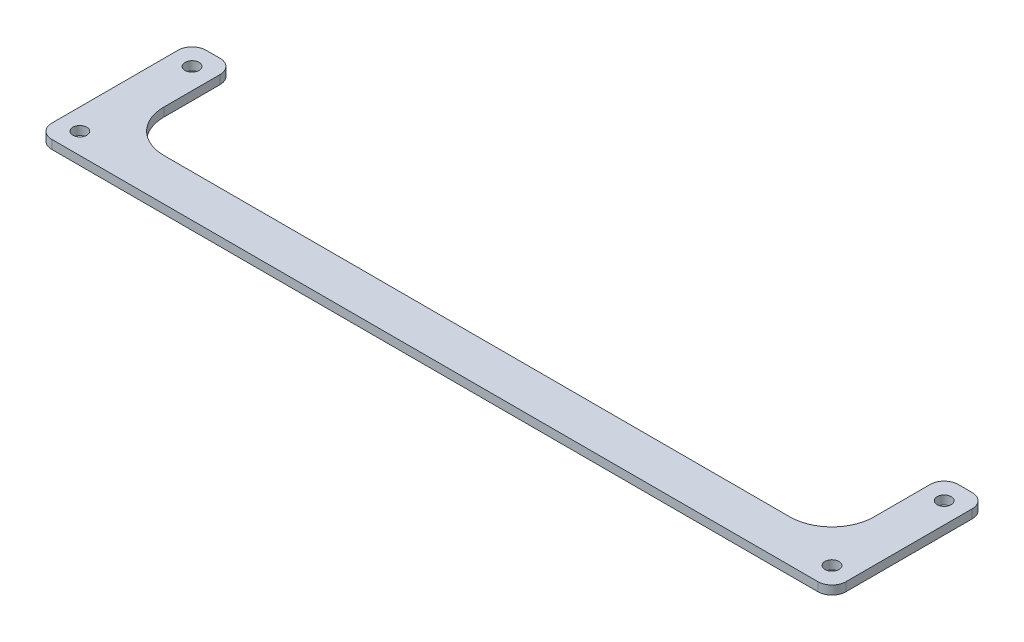
ISO-10303-21;
HEADER;
FILE_DESCRIPTION(('STEP AP214'),'2;1');
FILE_NAME('part.step','',(''),(''),'','','');
FILE_SCHEMA(('AUTOMOTIVE_DESIGN { 1 0 10303 214 1 1 1 1 }'));
ENDSEC;
DATA;
#1=APPLICATION_CONTEXT('core data for automotive mechanical design processes');
#2=APPLICATION_PROTOCOL_DEFINITION('international standard','automotive_design',2000,#1);
#3=PRODUCT_CONTEXT('',#1,'mechanical');
#4=PRODUCT('Part','Part','',(#3));
#5=PRODUCT_RELATED_PRODUCT_CATEGORY('part','',(#4));
#6=PRODUCT_DEFINITION_FORMATION('','',#4);
#7=PRODUCT_DEFINITION_CONTEXT('part definition',#1,'design');
#8=PRODUCT_DEFINITION('design','',#6,#7);
#9=PRODUCT_DEFINITION_SHAPE('','',#8);
#10=(LENGTH_UNIT() NAMED_UNIT(*) SI_UNIT(.MILLI.,.METRE.));
#11=(NAMED_UNIT(*) PLANE_ANGLE_UNIT() SI_UNIT($,.RADIAN.));
#12=(NAMED_UNIT(*) SI_UNIT($,.STERADIAN.) SOLID_ANGLE_UNIT());
#13=UNCERTAINTY_MEASURE_WITH_UNIT(LENGTH_MEASURE(1.E-05),#10,'distance_accuracy_value','');
#14=(GEOMETRIC_REPRESENTATION_CONTEXT(3) GLOBAL_UNCERTAINTY_ASSIGNED_CONTEXT((#13)) GLOBAL_UNIT_ASSIGNED_CONTEXT((#10,
#11,#12)) REPRESENTATION_CONTEXT('',''));
#15=CARTESIAN_POINT('',(0.,0.,0.));
#16=DIRECTION('',(0.,0.,1.));
#17=DIRECTION('',(1.,0.,0.));
#18=AXIS2_PLACEMENT_3D('',#15,#16,#17);
#19=CARTESIAN_POINT('',(0.,2.5,0.));
#20=DIRECTION('',(0.,1.,0.));
#21=DIRECTION('',(0.,0.,1.));
#22=AXIS2_PLACEMENT_3D('',#19,#20,#21);
#23=PLANE('',#22);
#24=CARTESIAN_POINT('',(193.665714924376,2.5,29.1309433813816));
#25=DIRECTION('',(0.,1.,0.));
#26=DIRECTION('',(0.,0.,1.));
#27=AXIS2_PLACEMENT_3D('',#24,#25,#26);
#28=CIRCLE('',#27,2.);
#29=CARTESIAN_POINT('',(193.665714924376,2.5,31.1309433813816));
#30=VERTEX_POINT('',#29);
#31=EDGE_CURVE('E583',#30,#30,#28,.T.);
#32=ORIENTED_EDGE('',*,*,#31,.F.);
#33=EDGE_LOOP('',(#32));
#34=FACE_BOUND('',#33,.T.);
#35=CARTESIAN_POINT('',(-20.7988364756241,2.5,-2.86905661861837));
#36=DIRECTION('',(0.,1.,0.));
#37=DIRECTION('',(0.,0.,1.));
#38=AXIS2_PLACEMENT_3D('',#35,#36,#37);
#39=CIRCLE('',#38,2.);
#40=CARTESIAN_POINT('',(-20.7988364756241,2.5,-0.869056618618374));
#41=VERTEX_POINT('',#40);
#42=EDGE_CURVE('E327',#41,#41,#39,.T.);
#43=ORIENTED_EDGE('',*,*,#42,.F.);
#44=EDGE_LOOP('',(#43));
#45=FACE_BOUND('',#44,.T.);
#46=DIRECTION('',(0.,0.,-1.));
#47=VECTOR('',#46,1.);
#48=CARTESIAN_POINT('',(199.665714924376,2.5,35.1309433813817));
#49=LINE('',#48,#47);
#50=CARTESIAN_POINT('',(199.665714924376,2.5,31.1309433813817));
#51=VERTEX_POINT('',#50);
#52=CARTESIAN_POINT('',(199.665714924376,2.5,-4.86905661861846));
#53=VERTEX_POINT('',#52);
#54=EDGE_CURVE('E306',#51,#53,#49,.T.);
#55=ORIENTED_EDGE('',*,*,#54,.T.);
#56=CARTESIAN_POINT('',(195.665714924376,2.5,-4.86905661861846));
#57=DIRECTION('',(0.,1.,0.));
#58=DIRECTION('',(0.,0.,1.));
#59=AXIS2_PLACEMENT_3D('',#56,#57,#58);
#60=CIRCLE('',#59,4.);
#61=CARTESIAN_POINT('',(195.665714924376,2.5,-8.86905661861846));
#62=VERTEX_POINT('',#61);
#63=EDGE_CURVE('E240',#53,#62,#60,.T.);
#64=ORIENTED_EDGE('',*,*,#63,.T.);
#65=DIRECTION('',(-1.,0.,0.));
#66=VECTOR('',#65,1.);
#67=CARTESIAN_POINT('',(199.665714924376,2.5,-8.86905661861846));
#68=LINE('',#67,#66);
#69=CARTESIAN_POINT('',(191.665714924376,2.5,-8.86905661861846));
#70=VERTEX_POINT('',#69);
#71=EDGE_CURVE('E173',#62,#70,#68,.T.);
#72=ORIENTED_EDGE('',*,*,#71,.T.);
#73=CARTESIAN_POINT('',(191.665714924376,2.5,-4.86905661861846));
#74=DIRECTION('',(0.,1.,0.));
#75=DIRECTION('',(0.,0.,1.));
#76=AXIS2_PLACEMENT_3D('',#73,#74,#75);
#77=CIRCLE('',#76,4.);
#78=CARTESIAN_POINT('',(187.665714924376,2.5,-4.86905661861846));
#79=VERTEX_POINT('',#78);
#80=EDGE_CURVE('E237',#70,#79,#77,.T.);
#81=ORIENTED_EDGE('',*,*,#80,.T.);
#82=DIRECTION('',(0.,0.,1.));
#83=VECTOR('',#82,1.);
#84=CARTESIAN_POINT('',(187.665714924376,2.5,-8.86905661861846));
#85=LINE('',#84,#83);
#86=CARTESIAN_POINT('',(187.665714924376,2.5,11.1309433813815));
#87=VERTEX_POINT('',#86);
#88=EDGE_CURVE('E301',#79,#87,#85,.T.);
#89=ORIENTED_EDGE('',*,*,#88,.T.);
#90=CARTESIAN_POINT('',(175.665714924376,2.5,11.1309433813815));
#91=DIRECTION('',(0.,1.,0.));
#92=DIRECTION('',(0.,0.,1.));
#93=AXIS2_PLACEMENT_3D('',#90,#91,#92);
#94=CIRCLE('',#93,12.);
#95=CARTESIAN_POINT('',(175.665714924376,2.5,23.1309433813815));
#96=VERTEX_POINT('',#95);
#97=EDGE_CURVE('E11',#87,#96,#94,.F.);
#98=ORIENTED_EDGE('',*,*,#97,.T.);
#99=DIRECTION('',(-1.,0.,0.));
#100=VECTOR('',#99,1.);
#101=CARTESIAN_POINT('',(-14.7988364756241,2.5,23.1309433813816));
#102=LINE('',#101,#100);
#103=CARTESIAN_POINT('',(-2.7988364756241,2.5,23.1309433813816));
#104=VERTEX_POINT('',#103);
#105=EDGE_CURVE('E297',#96,#104,#102,.T.);
#106=ORIENTED_EDGE('',*,*,#105,.T.);
#107=CARTESIAN_POINT('',(-2.7988364756241,2.5,11.1309433813816));
#108=DIRECTION('',(0.,1.,0.));
#109=DIRECTION('',(0.,0.,1.));
#110=AXIS2_PLACEMENT_3D('',#107,#108,#109);
#111=CIRCLE('',#110,12.);
#112=CARTESIAN_POINT('',(-14.7988364756241,2.5,11.1309433813816));
#113=VERTEX_POINT('',#112);
#114=EDGE_CURVE('E288',#104,#113,#111,.F.);
#115=ORIENTED_EDGE('',*,*,#114,.T.);
#116=DIRECTION('',(0.,0.,-1.));
#117=VECTOR('',#116,1.);
#118=CARTESIAN_POINT('',(-14.7988364756241,2.5,-8.86905661861843));
#119=LINE('',#118,#117);
#120=CARTESIAN_POINT('',(-14.7988364756241,2.5,-4.86905661861844));
#121=VERTEX_POINT('',#120);
#122=EDGE_CURVE('E294',#113,#121,#119,.T.);
#123=ORIENTED_EDGE('',*,*,#122,.T.);
#124=CARTESIAN_POINT('',(-18.7988364756241,2.5,-4.86905661861844));
#125=DIRECTION('',(0.,1.,0.));
#126=DIRECTION('',(0.,0.,1.));
#127=AXIS2_PLACEMENT_3D('',#124,#125,#126);
#128=CIRCLE('',#127,4.);
#129=CARTESIAN_POINT('',(-18.7988364756241,2.5,-8.86905661861844));
#130=VERTEX_POINT('',#129);
#131=EDGE_CURVE('E234',#121,#130,#128,.T.);
#132=ORIENTED_EDGE('',*,*,#131,.T.);
#133=DIRECTION('',(-1.,0.,0.));
#134=VECTOR('',#133,1.);
#135=CARTESIAN_POINT('',(-14.7988364756241,2.5,-8.86905661861843));
#136=LINE('',#135,#134);
#137=CARTESIAN_POINT('',(-22.7988364756241,2.5,-8.86905661861844));
#138=VERTEX_POINT('',#137);
#139=EDGE_CURVE('E204',#130,#138,#136,.T.);
#140=ORIENTED_EDGE('',*,*,#139,.T.);
#141=CARTESIAN_POINT('',(-22.7988364756241,2.5,-4.86905661861844));
#142=DIRECTION('',(0.,1.,0.));
#143=DIRECTION('',(0.,0.,1.));
#144=AXIS2_PLACEMENT_3D('',#141,#142,#143);
#145=CIRCLE('',#144,4.);
#146=CARTESIAN_POINT('',(-26.7988364756241,2.5,-4.86905661861844));
#147=VERTEX_POINT('',#146);
#148=EDGE_CURVE('E231',#138,#147,#145,.T.);
#149=ORIENTED_EDGE('',*,*,#148,.T.);
#150=DIRECTION('',(0.,0.,1.));
#151=VECTOR('',#150,1.);
#152=CARTESIAN_POINT('',(-26.7988364756241,2.5,35.1309433813818));
#153=LINE('',#152,#151);
#154=CARTESIAN_POINT('',(-26.7988364756241,2.5,31.1309433813818));
#155=VERTEX_POINT('',#154);
#156=EDGE_CURVE('E202',#147,#155,#153,.T.);
#157=ORIENTED_EDGE('',*,*,#156,.T.);
#158=CARTESIAN_POINT('',(-22.7988364756241,2.5,31.1309433813818));
#159=DIRECTION('',(0.,1.,0.));
#160=DIRECTION('',(0.,0.,1.));
#161=AXIS2_PLACEMENT_3D('',#158,#159,#160);
#162=CIRCLE('',#161,4.);
#163=CARTESIAN_POINT('',(-22.7988364756241,2.5,35.1309433813818));
#164=VERTEX_POINT('',#163);
#165=EDGE_CURVE('E225',#155,#164,#162,.T.);
#166=ORIENTED_EDGE('',*,*,#165,.T.);
#167=DIRECTION('',(1.,0.,0.));
#168=VECTOR('',#167,1.);
#169=CARTESIAN_POINT('',(199.665714924376,2.5,35.1309433813817));
#170=LINE('',#169,#168);
#171=CARTESIAN_POINT('',(195.665714924376,2.5,35.1309433813817));
#172=VERTEX_POINT('',#171);
#173=EDGE_CURVE('E310',#164,#172,#170,.T.);
#174=ORIENTED_EDGE('',*,*,#173,.T.);
#175=CARTESIAN_POINT('',(195.665714924376,2.5,31.1309433813817));
#176=DIRECTION('',(0.,1.,0.));
#177=DIRECTION('',(0.,0.,1.));
#178=AXIS2_PLACEMENT_3D('',#175,#176,#177);
#179=CIRCLE('',#178,4.);
#180=EDGE_CURVE('E228',#172,#51,#179,.T.);
#181=ORIENTED_EDGE('',*,*,#180,.T.);
#182=EDGE_LOOP('',(#55,#64,#72,#81,#89,#98,#106,#115,#123,#132,#140,#149,#157,#166,#174,#181));
#183=FACE_BOUND('',#182,.T.);
#184=CARTESIAN_POINT('',(-20.7988364756241,2.5,29.1309433813817));
#185=DIRECTION('',(0.,1.,0.));
#186=DIRECTION('',(0.,0.,1.));
#187=AXIS2_PLACEMENT_3D('',#184,#185,#186);
#188=CIRCLE('',#187,2.);
#189=CARTESIAN_POINT('',(-20.7988364756241,2.5,31.1309433813817));
#190=VERTEX_POINT('',#189);
#191=EDGE_CURVE('E574',#190,#190,#188,.T.);
#192=ORIENTED_EDGE('',*,*,#191,.F.);
#193=EDGE_LOOP('',(#192));
#194=FACE_BOUND('',#193,.T.);
#195=CARTESIAN_POINT('',(193.665714924376,2.5,-2.86905661861827));
#196=DIRECTION('',(0.,1.,0.));
#197=DIRECTION('',(0.,0.,1.));
#198=AXIS2_PLACEMENT_3D('',#195,#196,#197);
#199=CIRCLE('',#198,2.);
#200=CARTESIAN_POINT('',(193.665714924376,2.5,-0.869056618618276));
#201=VERTEX_POINT('',#200);
#202=EDGE_CURVE('E590',#201,#201,#199,.T.);
#203=ORIENTED_EDGE('',*,*,#202,.F.);
#204=EDGE_LOOP('',(#203));
#205=FACE_BOUND('',#204,.T.);
#206=ADVANCED_FACE('F39',(#34,#45,#183,#194,#205),#23,.T.);
#207=CARTESIAN_POINT('',(0.,0.,0.));
#208=DIRECTION('',(0.,1.,0.));
#209=DIRECTION('',(0.,0.,1.));
#210=AXIS2_PLACEMENT_3D('',#207,#208,#209);
#211=PLANE('',#210);
#212=DIRECTION('',(-1.,0.,0.));
#213=VECTOR('',#212,1.);
#214=CARTESIAN_POINT('',(199.665714924376,0.,-8.86905661861846));
#215=LINE('',#214,#213);
#216=CARTESIAN_POINT('',(195.665714924376,0.,-8.86905661861846));
#217=VERTEX_POINT('',#216);
#218=CARTESIAN_POINT('',(191.665714924376,0.,-8.86905661861846));
#219=VERTEX_POINT('',#218);
#220=EDGE_CURVE('E170',#217,#219,#215,.T.);
#221=ORIENTED_EDGE('',*,*,#220,.F.);
#222=CARTESIAN_POINT('',(195.665714924376,0.,-4.86905661861846));
#223=DIRECTION('',(0.,1.,0.));
#224=DIRECTION('',(0.,0.,1.));
#225=AXIS2_PLACEMENT_3D('',#222,#223,#224);
#226=CIRCLE('',#225,4.);
#227=CARTESIAN_POINT('',(199.665714924376,0.,-4.86905661861846));
#228=VERTEX_POINT('',#227);
#229=EDGE_CURVE('E153',#217,#228,#226,.F.);
#230=ORIENTED_EDGE('',*,*,#229,.T.);
#231=DIRECTION('',(0.,0.,-1.));
#232=VECTOR('',#231,1.);
#233=CARTESIAN_POINT('',(199.665714924376,0.,35.1309433813817));
#234=LINE('',#233,#232);
#235=CARTESIAN_POINT('',(199.665714924376,0.,31.1309433813817));
#236=VERTEX_POINT('',#235);
#237=EDGE_CURVE('E182',#236,#228,#234,.T.);
#238=ORIENTED_EDGE('',*,*,#237,.F.);
#239=CARTESIAN_POINT('',(195.665714924376,0.,31.1309433813817));
#240=DIRECTION('',(0.,1.,0.));
#241=DIRECTION('',(0.,0.,1.));
#242=AXIS2_PLACEMENT_3D('',#239,#240,#241);
#243=CIRCLE('',#242,4.);
#244=CARTESIAN_POINT('',(195.665714924376,0.,35.1309433813817));
#245=VERTEX_POINT('',#244);
#246=EDGE_CURVE('E208',#236,#245,#243,.F.);
#247=ORIENTED_EDGE('',*,*,#246,.T.);
#248=DIRECTION('',(1.,0.,0.));
#249=VECTOR('',#248,1.);
#250=CARTESIAN_POINT('',(199.665714924376,0.,35.1309433813817));
#251=LINE('',#250,#249);
#252=CARTESIAN_POINT('',(-22.7988364756241,0.,35.1309433813818));
#253=VERTEX_POINT('',#252);
#254=EDGE_CURVE('E188',#253,#245,#251,.T.);
#255=ORIENTED_EDGE('',*,*,#254,.F.);
#256=CARTESIAN_POINT('',(-22.7988364756241,0.,31.1309433813818));
#257=DIRECTION('',(0.,1.,0.));
#258=DIRECTION('',(0.,0.,1.));
#259=AXIS2_PLACEMENT_3D('',#256,#257,#258);
#260=CIRCLE('',#259,4.);
#261=CARTESIAN_POINT('',(-26.7988364756241,0.,31.1309433813818));
#262=VERTEX_POINT('',#261);
#263=EDGE_CURVE('E175',#253,#262,#260,.F.);
#264=ORIENTED_EDGE('',*,*,#263,.T.);
#265=DIRECTION('',(0.,0.,1.));
#266=VECTOR('',#265,1.);
#267=CARTESIAN_POINT('',(-26.7988364756241,0.,35.1309433813818));
#268=LINE('',#267,#266);
#269=CARTESIAN_POINT('',(-26.7988364756241,0.,-4.86905661861844));
#270=VERTEX_POINT('',#269);
#271=EDGE_CURVE('E324',#270,#262,#268,.T.);
#272=ORIENTED_EDGE('',*,*,#271,.F.);
#273=CARTESIAN_POINT('',(-22.7988364756241,0.,-4.86905661861844));
#274=DIRECTION('',(0.,1.,0.));
#275=DIRECTION('',(0.,0.,1.));
#276=AXIS2_PLACEMENT_3D('',#273,#274,#275);
#277=CIRCLE('',#276,4.);
#278=CARTESIAN_POINT('',(-22.7988364756241,0.,-8.86905661861844));
#279=VERTEX_POINT('',#278);
#280=EDGE_CURVE('E211',#270,#279,#277,.F.);
#281=ORIENTED_EDGE('',*,*,#280,.T.);
#282=DIRECTION('',(-1.,0.,0.));
#283=VECTOR('',#282,1.);
#284=CARTESIAN_POINT('',(-14.7988364756241,0.,-8.86905661861843));
#285=LINE('',#284,#283);
#286=CARTESIAN_POINT('',(-18.7988364756241,0.,-8.86905661861844));
#287=VERTEX_POINT('',#286);
#288=EDGE_CURVE('E198',#287,#279,#285,.T.);
#289=ORIENTED_EDGE('',*,*,#288,.F.);
#290=CARTESIAN_POINT('',(-18.7988364756241,0.,-4.86905661861844));
#291=DIRECTION('',(0.,1.,0.));
#292=DIRECTION('',(0.,0.,1.));
#293=AXIS2_PLACEMENT_3D('',#290,#291,#292);
#294=CIRCLE('',#293,4.);
#295=CARTESIAN_POINT('',(-14.7988364756241,0.,-4.86905661861844));
#296=VERTEX_POINT('',#295);
#297=EDGE_CURVE('E214',#287,#296,#294,.F.);
#298=ORIENTED_EDGE('',*,*,#297,.T.);
#299=DIRECTION('',(0.,0.,-1.));
#300=VECTOR('',#299,1.);
#301=CARTESIAN_POINT('',(-14.7988364756241,0.,-8.86905661861843));
#302=LINE('',#301,#300);
#303=CARTESIAN_POINT('',(-14.7988364756241,0.,11.1309433813816));
#304=VERTEX_POINT('',#303);
#305=EDGE_CURVE('E195',#304,#296,#302,.T.);
#306=ORIENTED_EDGE('',*,*,#305,.F.);
#307=CARTESIAN_POINT('',(-2.7988364756241,0.,11.1309433813816));
#308=DIRECTION('',(0.,1.,0.));
#309=DIRECTION('',(0.,0.,1.));
#310=AXIS2_PLACEMENT_3D('',#307,#308,#309);
#311=CIRCLE('',#310,12.);
#312=CARTESIAN_POINT('',(-2.7988364756241,0.,23.1309433813816));
#313=VERTEX_POINT('',#312);
#314=EDGE_CURVE('E285',#304,#313,#311,.T.);
#315=ORIENTED_EDGE('',*,*,#314,.T.);
#316=DIRECTION('',(-1.,0.,0.));
#317=VECTOR('',#316,1.);
#318=CARTESIAN_POINT('',(-14.7988364756241,0.,23.1309433813816));
#319=LINE('',#318,#317);
#320=CARTESIAN_POINT('',(175.665714924376,0.,23.1309433813815));
#321=VERTEX_POINT('',#320);
#322=EDGE_CURVE('E186',#321,#313,#319,.T.);
#323=ORIENTED_EDGE('',*,*,#322,.F.);
#324=CARTESIAN_POINT('',(175.665714924376,0.,11.1309433813815));
#325=DIRECTION('',(0.,1.,0.));
#326=DIRECTION('',(0.,0.,1.));
#327=AXIS2_PLACEMENT_3D('',#324,#325,#326);
#328=CIRCLE('',#327,12.);
#329=CARTESIAN_POINT('',(187.665714924376,0.,11.1309433813815));
#330=VERTEX_POINT('',#329);
#331=EDGE_CURVE('E48',#321,#330,#328,.T.);
#332=ORIENTED_EDGE('',*,*,#331,.T.);
#333=DIRECTION('',(0.,0.,1.));
#334=VECTOR('',#333,1.);
#335=CARTESIAN_POINT('',(187.665714924376,0.,-8.86905661861846));
#336=LINE('',#335,#334);
#337=CARTESIAN_POINT('',(187.665714924376,0.,-4.86905661861846));
#338=VERTEX_POINT('',#337);
#339=EDGE_CURVE('E181',#338,#330,#336,.T.);
#340=ORIENTED_EDGE('',*,*,#339,.F.);
#341=CARTESIAN_POINT('',(191.665714924376,0.,-4.86905661861846));
#342=DIRECTION('',(0.,1.,0.));
#343=DIRECTION('',(0.,0.,1.));
#344=AXIS2_PLACEMENT_3D('',#341,#342,#343);
#345=CIRCLE('',#344,4.);
#346=EDGE_CURVE('E164',#338,#219,#345,.F.);
#347=ORIENTED_EDGE('',*,*,#346,.T.);
#348=EDGE_LOOP('',(#221,#230,#238,#247,#255,#264,#272,#281,#289,#298,#306,#315,#323,#332,#340,#347));
#349=FACE_BOUND('',#348,.T.);
#350=CARTESIAN_POINT('',(-20.7988364756241,0.,-2.86905661861837));
#351=DIRECTION('',(0.,1.,0.));
#352=DIRECTION('',(0.,0.,1.));
#353=AXIS2_PLACEMENT_3D('',#350,#351,#352);
#354=CIRCLE('',#353,2.);
#355=CARTESIAN_POINT('',(-20.7988364756241,0.,-0.869056618618374));
#356=VERTEX_POINT('',#355);
#357=EDGE_CURVE('E321',#356,#356,#354,.T.);
#358=ORIENTED_EDGE('',*,*,#357,.T.);
#359=EDGE_LOOP('',(#358));
#360=FACE_BOUND('',#359,.T.);
#361=CARTESIAN_POINT('',(-20.7988364756241,0.,29.1309433813817));
#362=DIRECTION('',(0.,1.,0.));
#363=DIRECTION('',(0.,0.,1.));
#364=AXIS2_PLACEMENT_3D('',#361,#362,#363);
#365=CIRCLE('',#364,2.);
#366=CARTESIAN_POINT('',(-20.7988364756241,0.,31.1309433813817));
#367=VERTEX_POINT('',#366);
#368=EDGE_CURVE('E578',#367,#367,#365,.T.);
#369=ORIENTED_EDGE('',*,*,#368,.T.);
#370=EDGE_LOOP('',(#369));
#371=FACE_BOUND('',#370,.T.);
#372=CARTESIAN_POINT('',(193.665714924376,0.,29.1309433813816));
#373=DIRECTION('',(0.,1.,0.));
#374=DIRECTION('',(0.,0.,1.));
#375=AXIS2_PLACEMENT_3D('',#372,#373,#374);
#376=CIRCLE('',#375,2.);
#377=CARTESIAN_POINT('',(193.665714924376,0.,31.1309433813816));
#378=VERTEX_POINT('',#377);
#379=EDGE_CURVE('E586',#378,#378,#376,.T.);
#380=ORIENTED_EDGE('',*,*,#379,.T.);
#381=EDGE_LOOP('',(#380));
#382=FACE_BOUND('',#381,.T.);
#383=CARTESIAN_POINT('',(193.665714924376,0.,-2.86905661861827));
#384=DIRECTION('',(0.,1.,0.));
#385=DIRECTION('',(0.,0.,1.));
#386=AXIS2_PLACEMENT_3D('',#383,#384,#385);
#387=CIRCLE('',#386,2.);
#388=CARTESIAN_POINT('',(193.665714924376,0.,-0.869056618618276));
#389=VERTEX_POINT('',#388);
#390=EDGE_CURVE('E594',#389,#389,#387,.T.);
#391=ORIENTED_EDGE('',*,*,#390,.T.);
#392=EDGE_LOOP('',(#391));
#393=FACE_BOUND('',#392,.T.);
#394=ADVANCED_FACE('F178',(#349,#360,#371,#382,#393),#211,.F.);
#395=CARTESIAN_POINT('',(-26.7988364756241,2.5,35.1309433813818));
#396=DIRECTION('',(1.,0.,0.));
#397=DIRECTION('',(0.,0.,-1.));
#398=AXIS2_PLACEMENT_3D('',#395,#396,#397);
#399=PLANE('',#398);
#400=ORIENTED_EDGE('',*,*,#156,.F.);
#401=DIRECTION('',(0.,-1.,0.));
#402=VECTOR('',#401,1.);
#403=CARTESIAN_POINT('',(-26.7988364756241,2.5,-4.86905661861844));
#404=LINE('',#403,#402);
#405=EDGE_CURVE('E261',#147,#270,#404,.T.);
#406=ORIENTED_EDGE('',*,*,#405,.T.);
#407=ORIENTED_EDGE('',*,*,#271,.T.);
#408=DIRECTION('',(0.,-1.,0.));
#409=VECTOR('',#408,1.);
#410=CARTESIAN_POINT('',(-26.7988364756241,2.5,31.1309433813818));
#411=LINE('',#410,#409);
#412=EDGE_CURVE('E258',#262,#155,#411,.F.);
#413=ORIENTED_EDGE('',*,*,#412,.T.);
#414=EDGE_LOOP('',(#400,#406,#407,#413));
#415=FACE_BOUND('',#414,.T.);
#416=ADVANCED_FACE('F352',(#415),#399,.F.);
#417=CARTESIAN_POINT('',(199.665714924376,2.5,35.1309433813817));
#418=DIRECTION('',(0.,0.,-1.));
#419=DIRECTION('',(-1.,0.,0.));
#420=AXIS2_PLACEMENT_3D('',#417,#418,#419);
#421=PLANE('',#420);
#422=ORIENTED_EDGE('',*,*,#254,.T.);
#423=DIRECTION('',(0.,-1.,0.));
#424=VECTOR('',#423,1.);
#425=CARTESIAN_POINT('',(195.665714924376,2.5,35.1309433813817));
#426=LINE('',#425,#424);
#427=EDGE_CURVE('E269',#245,#172,#426,.F.);
#428=ORIENTED_EDGE('',*,*,#427,.T.);
#429=ORIENTED_EDGE('',*,*,#173,.F.);
#430=DIRECTION('',(0.,-1.,0.));
#431=VECTOR('',#430,1.);
#432=CARTESIAN_POINT('',(-22.7988364756241,2.5,35.1309433813818));
#433=LINE('',#432,#431);
#434=EDGE_CURVE('E265',#164,#253,#433,.T.);
#435=ORIENTED_EDGE('',*,*,#434,.T.);
#436=EDGE_LOOP('',(#422,#428,#429,#435));
#437=FACE_BOUND('',#436,.T.);
#438=ADVANCED_FACE('F333',(#437),#421,.F.);
#439=CARTESIAN_POINT('',(199.665714924376,2.5,35.1309433813817));
#440=DIRECTION('',(-1.,0.,0.));
#441=DIRECTION('',(0.,0.,1.));
#442=AXIS2_PLACEMENT_3D('',#439,#440,#441);
#443=PLANE('',#442);
#444=ORIENTED_EDGE('',*,*,#237,.T.);
#445=DIRECTION('',(0.,-1.,0.));
#446=VECTOR('',#445,1.);
#447=CARTESIAN_POINT('',(199.665714924376,2.5,-4.86905661861846));
#448=LINE('',#447,#446);
#449=EDGE_CURVE('E158',#228,#53,#448,.F.);
#450=ORIENTED_EDGE('',*,*,#449,.T.);
#451=ORIENTED_EDGE('',*,*,#54,.F.);
#452=DIRECTION('',(0.,-1.,0.));
#453=VECTOR('',#452,1.);
#454=CARTESIAN_POINT('',(199.665714924376,2.5,31.1309433813817));
#455=LINE('',#454,#453);
#456=EDGE_CURVE('E163',#51,#236,#455,.T.);
#457=ORIENTED_EDGE('',*,*,#456,.T.);
#458=EDGE_LOOP('',(#444,#450,#451,#457));
#459=FACE_BOUND('',#458,.T.);
#460=ADVANCED_FACE('F343',(#459),#443,.F.);
#461=CARTESIAN_POINT('',(199.665714924376,2.5,-8.86905661861846));
#462=DIRECTION('',(0.,0.,1.));
#463=DIRECTION('',(1.,0.,0.));
#464=AXIS2_PLACEMENT_3D('',#461,#462,#463);
#465=PLANE('',#464);
#466=ORIENTED_EDGE('',*,*,#71,.F.);
#467=DIRECTION('',(0.,-1.,0.));
#468=VECTOR('',#467,1.);
#469=CARTESIAN_POINT('',(195.665714924376,2.5,-8.86905661861846));
#470=LINE('',#469,#468);
#471=EDGE_CURVE('E157',#62,#217,#470,.T.);
#472=ORIENTED_EDGE('',*,*,#471,.T.);
#473=ORIENTED_EDGE('',*,*,#220,.T.);
#474=DIRECTION('',(0.,-1.,0.));
#475=VECTOR('',#474,1.);
#476=CARTESIAN_POINT('',(191.665714924376,2.5,-8.86905661861846));
#477=LINE('',#476,#475);
#478=EDGE_CURVE('E176',#219,#70,#477,.F.);
#479=ORIENTED_EDGE('',*,*,#478,.T.);
#480=EDGE_LOOP('',(#466,#472,#473,#479));
#481=FACE_BOUND('',#480,.T.);
#482=ADVANCED_FACE('F169',(#481),#465,.F.);
#483=CARTESIAN_POINT('',(187.665714924376,2.5,-8.86905661861846));
#484=DIRECTION('',(1.,0.,0.));
#485=DIRECTION('',(0.,0.,-1.));
#486=AXIS2_PLACEMENT_3D('',#483,#484,#485);
#487=PLANE('',#486);
#488=ORIENTED_EDGE('',*,*,#339,.T.);
#489=DIRECTION('',(0.,-1.,0.));
#490=VECTOR('',#489,1.);
#491=CARTESIAN_POINT('',(187.665714924376,2.5,11.1309433813815));
#492=LINE('',#491,#490);
#493=EDGE_CURVE('E61',#330,#87,#492,.F.);
#494=ORIENTED_EDGE('',*,*,#493,.T.);
#495=ORIENTED_EDGE('',*,*,#88,.F.);
#496=DIRECTION('',(0.,-1.,0.));
#497=VECTOR('',#496,1.);
#498=CARTESIAN_POINT('',(187.665714924376,2.5,-4.86905661861846));
#499=LINE('',#498,#497);
#500=EDGE_CURVE('E243',#79,#338,#499,.T.);
#501=ORIENTED_EDGE('',*,*,#500,.T.);
#502=EDGE_LOOP('',(#488,#494,#495,#501));
#503=FACE_BOUND('',#502,.T.);
#504=ADVANCED_FACE('F350',(#503),#487,.F.);
#505=CARTESIAN_POINT('',(-14.7988364756241,2.5,23.1309433813816));
#506=DIRECTION('',(0.,0.,1.));
#507=DIRECTION('',(1.,0.,0.));
#508=AXIS2_PLACEMENT_3D('',#505,#506,#507);
#509=PLANE('',#508);
#510=ORIENTED_EDGE('',*,*,#322,.T.);
#511=DIRECTION('',(0.,-1.,0.));
#512=VECTOR('',#511,1.);
#513=CARTESIAN_POINT('',(-2.7988364756241,2.5,23.1309433813816));
#514=LINE('',#513,#512);
#515=EDGE_CURVE('E280',#313,#104,#514,.F.);
#516=ORIENTED_EDGE('',*,*,#515,.T.);
#517=ORIENTED_EDGE('',*,*,#105,.F.);
#518=DIRECTION('',(0.,-1.,0.));
#519=VECTOR('',#518,1.);
#520=CARTESIAN_POINT('',(175.665714924376,0.,23.1309433813815));
#521=LINE('',#520,#519);
#522=EDGE_CURVE('E276',#96,#321,#521,.T.);
#523=ORIENTED_EDGE('',*,*,#522,.T.);
#524=EDGE_LOOP('',(#510,#516,#517,#523));
#525=FACE_BOUND('',#524,.T.);
#526=ADVANCED_FACE('F374',(#525),#509,.F.);
#527=CARTESIAN_POINT('',(-14.7988364756241,2.5,-8.86905661861843));
#528=DIRECTION('',(-1.,0.,0.));
#529=DIRECTION('',(0.,0.,1.));
#530=AXIS2_PLACEMENT_3D('',#527,#528,#529);
#531=PLANE('',#530);
#532=ORIENTED_EDGE('',*,*,#122,.F.);
#533=DIRECTION('',(0.,-1.,0.));
#534=VECTOR('',#533,1.);
#535=CARTESIAN_POINT('',(-14.7988364756241,0.,11.1309433813816));
#536=LINE('',#535,#534);
#537=EDGE_CURVE('E272',#113,#304,#536,.T.);
#538=ORIENTED_EDGE('',*,*,#537,.T.);
#539=ORIENTED_EDGE('',*,*,#305,.T.);
#540=DIRECTION('',(0.,-1.,0.));
#541=VECTOR('',#540,1.);
#542=CARTESIAN_POINT('',(-14.7988364756241,2.5,-4.86905661861844));
#543=LINE('',#542,#541);
#544=EDGE_CURVE('E254',#296,#121,#543,.F.);
#545=ORIENTED_EDGE('',*,*,#544,.T.);
#546=EDGE_LOOP('',(#532,#538,#539,#545));
#547=FACE_BOUND('',#546,.T.);
#548=ADVANCED_FACE('F370',(#547),#531,.F.);
#549=CARTESIAN_POINT('',(-14.7988364756241,2.5,-8.86905661861843));
#550=DIRECTION('',(0.,0.,1.));
#551=DIRECTION('',(1.,0.,0.));
#552=AXIS2_PLACEMENT_3D('',#549,#550,#551);
#553=PLANE('',#552);
#554=ORIENTED_EDGE('',*,*,#139,.F.);
#555=DIRECTION('',(0.,-1.,0.));
#556=VECTOR('',#555,1.);
#557=CARTESIAN_POINT('',(-18.7988364756241,2.5,-8.86905661861844));
#558=LINE('',#557,#556);
#559=EDGE_CURVE('E250',#130,#287,#558,.T.);
#560=ORIENTED_EDGE('',*,*,#559,.T.);
#561=ORIENTED_EDGE('',*,*,#288,.T.);
#562=DIRECTION('',(0.,-1.,0.));
#563=VECTOR('',#562,1.);
#564=CARTESIAN_POINT('',(-22.7988364756241,2.5,-8.86905661861844));
#565=LINE('',#564,#563);
#566=EDGE_CURVE('E247',#279,#138,#565,.F.);
#567=ORIENTED_EDGE('',*,*,#566,.T.);
#568=EDGE_LOOP('',(#554,#560,#561,#567));
#569=FACE_BOUND('',#568,.T.);
#570=ADVANCED_FACE('F367',(#569),#553,.F.);
#571=CARTESIAN_POINT('',(-20.7988364756241,2.5,-2.86905661861837));
#572=DIRECTION('',(0.,-1.,0.));
#573=DIRECTION('',(0.,0.,-1.));
#574=AXIS2_PLACEMENT_3D('',#571,#572,#573);
#575=CYLINDRICAL_SURFACE('',#574,2.);
#576=ORIENTED_EDGE('',*,*,#42,.T.);
#577=EDGE_LOOP('',(#576));
#578=FACE_BOUND('',#577,.T.);
#579=ORIENTED_EDGE('',*,*,#357,.F.);
#580=EDGE_LOOP('',(#579));
#581=FACE_BOUND('',#580,.T.);
#582=ADVANCED_FACE('F364',(#578,#581),#575,.F.);
#583=CARTESIAN_POINT('',(-20.7988364756241,2.5,29.1309433813817));
#584=DIRECTION('',(0.,-1.,0.));
#585=DIRECTION('',(0.,0.,-1.));
#586=AXIS2_PLACEMENT_3D('',#583,#584,#585);
#587=CYLINDRICAL_SURFACE('',#586,2.);
#588=ORIENTED_EDGE('',*,*,#191,.T.);
#589=EDGE_LOOP('',(#588));
#590=FACE_BOUND('',#589,.T.);
#591=ORIENTED_EDGE('',*,*,#368,.F.);
#592=EDGE_LOOP('',(#591));
#593=FACE_BOUND('',#592,.T.);
#594=ADVANCED_FACE('F546',(#590,#593),#587,.F.);
#595=CARTESIAN_POINT('',(193.665714924376,2.5,29.1309433813816));
#596=DIRECTION('',(0.,-1.,0.));
#597=DIRECTION('',(0.,0.,-1.));
#598=AXIS2_PLACEMENT_3D('',#595,#596,#597);
#599=CYLINDRICAL_SURFACE('',#598,2.);
#600=ORIENTED_EDGE('',*,*,#31,.T.);
#601=EDGE_LOOP('',(#600));
#602=FACE_BOUND('',#601,.T.);
#603=ORIENTED_EDGE('',*,*,#379,.F.);
#604=EDGE_LOOP('',(#603));
#605=FACE_BOUND('',#604,.T.);
#606=ADVANCED_FACE('F539',(#602,#605),#599,.F.);
#607=CARTESIAN_POINT('',(193.665714924376,2.5,-2.86905661861827));
#608=DIRECTION('',(0.,-1.,0.));
#609=DIRECTION('',(0.,0.,-1.));
#610=AXIS2_PLACEMENT_3D('',#607,#608,#609);
#611=CYLINDRICAL_SURFACE('',#610,2.);
#612=ORIENTED_EDGE('',*,*,#202,.T.);
#613=EDGE_LOOP('',(#612));
#614=FACE_BOUND('',#613,.T.);
#615=ORIENTED_EDGE('',*,*,#390,.F.);
#616=EDGE_LOOP('',(#615));
#617=FACE_BOUND('',#616,.T.);
#618=ADVANCED_FACE('F429',(#614,#617),#611,.F.);
#619=CARTESIAN_POINT('',(195.665714924376,2.5,-4.86905661861846));
#620=DIRECTION('',(0.,-1.,0.));
#621=DIRECTION('',(0.,0.,-1.));
#622=AXIS2_PLACEMENT_3D('',#619,#620,#621);
#623=CYLINDRICAL_SURFACE('',#622,4.);
#624=ORIENTED_EDGE('',*,*,#63,.F.);
#625=ORIENTED_EDGE('',*,*,#449,.F.);
#626=ORIENTED_EDGE('',*,*,#229,.F.);
#627=ORIENTED_EDGE('',*,*,#471,.F.);
#628=EDGE_LOOP('',(#624,#625,#626,#627));
#629=FACE_BOUND('',#628,.T.);
#630=ADVANCED_FACE('F156',(#629),#623,.T.);
#631=CARTESIAN_POINT('',(191.665714924376,2.5,-4.86905661861846));
#632=DIRECTION('',(0.,-1.,0.));
#633=DIRECTION('',(0.,0.,-1.));
#634=AXIS2_PLACEMENT_3D('',#631,#632,#633);
#635=CYLINDRICAL_SURFACE('',#634,4.);
#636=ORIENTED_EDGE('',*,*,#80,.F.);
#637=ORIENTED_EDGE('',*,*,#478,.F.);
#638=ORIENTED_EDGE('',*,*,#346,.F.);
#639=ORIENTED_EDGE('',*,*,#500,.F.);
#640=EDGE_LOOP('',(#636,#637,#638,#639));
#641=FACE_BOUND('',#640,.T.);
#642=ADVANCED_FACE('F423',(#641),#635,.T.);
#643=CARTESIAN_POINT('',(-18.7988364756241,2.5,-4.86905661861844));
#644=DIRECTION('',(0.,-1.,0.));
#645=DIRECTION('',(0.,0.,-1.));
#646=AXIS2_PLACEMENT_3D('',#643,#644,#645);
#647=CYLINDRICAL_SURFACE('',#646,4.);
#648=ORIENTED_EDGE('',*,*,#131,.F.);
#649=ORIENTED_EDGE('',*,*,#544,.F.);
#650=ORIENTED_EDGE('',*,*,#297,.F.);
#651=ORIENTED_EDGE('',*,*,#559,.F.);
#652=EDGE_LOOP('',(#648,#649,#650,#651));
#653=FACE_BOUND('',#652,.T.);
#654=ADVANCED_FACE('F398',(#653),#647,.T.);
#655=CARTESIAN_POINT('',(-22.7988364756241,2.5,-4.86905661861844));
#656=DIRECTION('',(0.,-1.,0.));
#657=DIRECTION('',(0.,0.,-1.));
#658=AXIS2_PLACEMENT_3D('',#655,#656,#657);
#659=CYLINDRICAL_SURFACE('',#658,4.);
#660=ORIENTED_EDGE('',*,*,#148,.F.);
#661=ORIENTED_EDGE('',*,*,#566,.F.);
#662=ORIENTED_EDGE('',*,*,#280,.F.);
#663=ORIENTED_EDGE('',*,*,#405,.F.);
#664=EDGE_LOOP('',(#660,#661,#662,#663));
#665=FACE_BOUND('',#664,.T.);
#666=ADVANCED_FACE('F404',(#665),#659,.T.);
#667=CARTESIAN_POINT('',(195.665714924376,2.5,31.1309433813817));
#668=DIRECTION('',(0.,-1.,0.));
#669=DIRECTION('',(0.,0.,-1.));
#670=AXIS2_PLACEMENT_3D('',#667,#668,#669);
#671=CYLINDRICAL_SURFACE('',#670,4.);
#672=ORIENTED_EDGE('',*,*,#180,.F.);
#673=ORIENTED_EDGE('',*,*,#427,.F.);
#674=ORIENTED_EDGE('',*,*,#246,.F.);
#675=ORIENTED_EDGE('',*,*,#456,.F.);
#676=EDGE_LOOP('',(#672,#673,#674,#675));
#677=FACE_BOUND('',#676,.T.);
#678=ADVANCED_FACE('F338',(#677),#671,.T.);
#679=CARTESIAN_POINT('',(-22.7988364756241,2.5,31.1309433813818));
#680=DIRECTION('',(0.,-1.,0.));
#681=DIRECTION('',(0.,0.,-1.));
#682=AXIS2_PLACEMENT_3D('',#679,#680,#681);
#683=CYLINDRICAL_SURFACE('',#682,4.);
#684=ORIENTED_EDGE('',*,*,#165,.F.);
#685=ORIENTED_EDGE('',*,*,#412,.F.);
#686=ORIENTED_EDGE('',*,*,#263,.F.);
#687=ORIENTED_EDGE('',*,*,#434,.F.);
#688=EDGE_LOOP('',(#684,#685,#686,#687));
#689=FACE_BOUND('',#688,.T.);
#690=ADVANCED_FACE('F410',(#689),#683,.T.);
#691=CARTESIAN_POINT('',(-2.7988364756241,2.5,11.1309433813816));
#692=DIRECTION('',(0.,1.,0.));
#693=DIRECTION('',(0.,0.,1.));
#694=AXIS2_PLACEMENT_3D('',#691,#692,#693);
#695=CYLINDRICAL_SURFACE('',#694,12.);
#696=ORIENTED_EDGE('',*,*,#114,.F.);
#697=ORIENTED_EDGE('',*,*,#515,.F.);
#698=ORIENTED_EDGE('',*,*,#314,.F.);
#699=ORIENTED_EDGE('',*,*,#537,.F.);
#700=EDGE_LOOP('',(#696,#697,#698,#699));
#701=FACE_BOUND('',#700,.T.);
#702=ADVANCED_FACE('F390',(#701),#695,.F.);
#703=CARTESIAN_POINT('',(175.665714924376,2.5,11.1309433813815));
#704=DIRECTION('',(0.,1.,0.));
#705=DIRECTION('',(0.,0.,1.));
#706=AXIS2_PLACEMENT_3D('',#703,#704,#705);
#707=CYLINDRICAL_SURFACE('',#706,12.);
#708=ORIENTED_EDGE('',*,*,#97,.F.);
#709=ORIENTED_EDGE('',*,*,#493,.F.);
#710=ORIENTED_EDGE('',*,*,#331,.F.);
#711=ORIENTED_EDGE('',*,*,#522,.F.);
#712=EDGE_LOOP('',(#708,#709,#710,#711));
#713=FACE_BOUND('',#712,.T.);
#714=ADVANCED_FACE('F41',(#713),#707,.F.);
#715=CLOSED_SHELL('',(#206,#394,#416,#438,#460,#482,#504,#526,#548,#570,#582,#594,#606,#618,
#630,#642,#654,#666,#678,#690,#702,#714));
#716=MANIFOLD_SOLID_BREP('B2',#715);
#717=ADVANCED_BREP_SHAPE_REPRESENTATION('',(#18,#716),#14);
#718=SHAPE_DEFINITION_REPRESENTATION(#9,#717);
ENDSEC;
END-ISO-10303-21;
